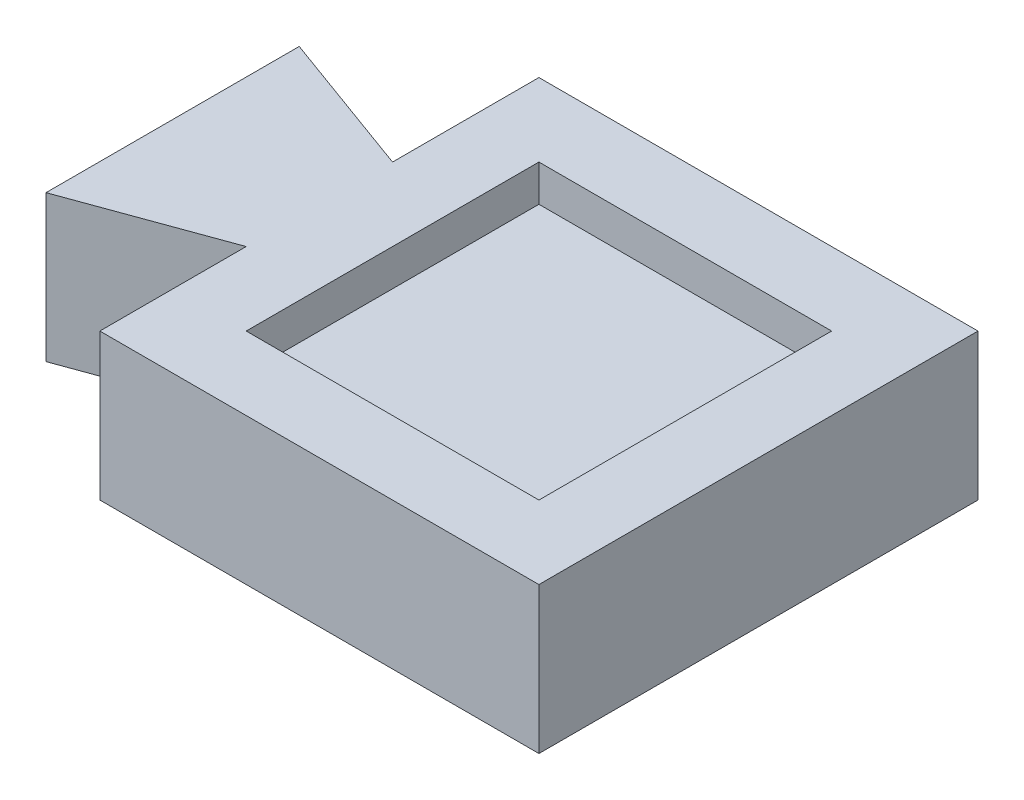
ISO-10303-21;
HEADER;
FILE_DESCRIPTION(('STEP AP214'),'2;1');
FILE_NAME('part.step','',(''),(''),'','','');
FILE_SCHEMA(('AUTOMOTIVE_DESIGN { 1 0 10303 214 1 1 1 1 }'));
ENDSEC;
DATA;
#1=APPLICATION_CONTEXT('core data for automotive mechanical design processes');
#2=APPLICATION_PROTOCOL_DEFINITION('international standard','automotive_design',2000,#1);
#3=PRODUCT_CONTEXT('',#1,'mechanical');
#4=PRODUCT('Part','Part','',(#3));
#5=PRODUCT_RELATED_PRODUCT_CATEGORY('part','',(#4));
#6=PRODUCT_DEFINITION_FORMATION('','',#4);
#7=PRODUCT_DEFINITION_CONTEXT('part definition',#1,'design');
#8=PRODUCT_DEFINITION('design','',#6,#7);
#9=PRODUCT_DEFINITION_SHAPE('','',#8);
#10=(LENGTH_UNIT() NAMED_UNIT(*) SI_UNIT(.MILLI.,.METRE.));
#11=(NAMED_UNIT(*) PLANE_ANGLE_UNIT() SI_UNIT($,.RADIAN.));
#12=(NAMED_UNIT(*) SI_UNIT($,.STERADIAN.) SOLID_ANGLE_UNIT());
#13=UNCERTAINTY_MEASURE_WITH_UNIT(LENGTH_MEASURE(1.E-05),#10,'distance_accuracy_value','');
#14=(GEOMETRIC_REPRESENTATION_CONTEXT(3) GLOBAL_UNCERTAINTY_ASSIGNED_CONTEXT((#13)) GLOBAL_UNIT_ASSIGNED_CONTEXT((#10,
#11,#12)) REPRESENTATION_CONTEXT('',''));
#15=CARTESIAN_POINT('',(0.,0.,0.));
#16=DIRECTION('',(0.,0.,1.));
#17=DIRECTION('',(1.,0.,0.));
#18=AXIS2_PLACEMENT_3D('',#15,#16,#17);
#19=CARTESIAN_POINT('',(0.,25.4,0.));
#20=DIRECTION('',(1.,0.,0.));
#21=DIRECTION('',(0.,0.,-1.));
#22=AXIS2_PLACEMENT_3D('',#19,#20,#21);
#23=PLANE('',#22);
#24=DIRECTION('',(0.,0.,1.));
#25=VECTOR('',#24,1.);
#26=CARTESIAN_POINT('',(0.,0.,0.));
#27=LINE('',#26,#25);
#28=CARTESIAN_POINT('',(0.,0.,0.));
#29=VERTEX_POINT('',#28);
#30=CARTESIAN_POINT('',(0.,0.,25.4));
#31=VERTEX_POINT('',#30);
#32=EDGE_CURVE('E140',#29,#31,#27,.T.);
#33=ORIENTED_EDGE('',*,*,#32,.T.);
#34=DIRECTION('',(0.,-1.,0.));
#35=VECTOR('',#34,1.);
#36=CARTESIAN_POINT('',(0.,25.4,25.4));
#37=LINE('',#36,#35);
#38=CARTESIAN_POINT('',(0.,25.4,25.4));
#39=VERTEX_POINT('',#38);
#40=EDGE_CURVE('E11',#39,#31,#37,.T.);
#41=ORIENTED_EDGE('',*,*,#40,.F.);
#42=DIRECTION('',(0.,0.,1.));
#43=VECTOR('',#42,1.);
#44=CARTESIAN_POINT('',(0.,25.4,0.));
#45=LINE('',#44,#43);
#46=CARTESIAN_POINT('',(0.,25.4,0.));
#47=VERTEX_POINT('',#46);
#48=EDGE_CURVE('E156',#47,#39,#45,.T.);
#49=ORIENTED_EDGE('',*,*,#48,.F.);
#50=DIRECTION('',(0.,-1.,0.));
#51=VECTOR('',#50,1.);
#52=CARTESIAN_POINT('',(0.,25.4,0.));
#53=LINE('',#52,#51);
#54=EDGE_CURVE('E136',#47,#29,#53,.T.);
#55=ORIENTED_EDGE('',*,*,#54,.T.);
#56=EDGE_LOOP('',(#33,#41,#49,#55));
#57=FACE_BOUND('',#56,.T.);
#58=ADVANCED_FACE('F32',(#57),#23,.F.);
#59=CARTESIAN_POINT('',(0.,25.4,25.4));
#60=DIRECTION('',(-0.342020143325673,0.,0.939692620785907));
#61=DIRECTION('',(0.939692620785907,0.,0.342020143325673));
#62=AXIS2_PLACEMENT_3D('',#59,#60,#61);
#63=PLANE('',#62);
#64=DIRECTION('',(-0.939692620785907,0.,-0.342020143325673));
#65=VECTOR('',#64,1.);
#66=CARTESIAN_POINT('',(0.,0.,25.4));
#67=LINE('',#66,#65);
#68=CARTESIAN_POINT('',(-25.4718631557635,0.,16.129));
#69=VERTEX_POINT('',#68);
#70=EDGE_CURVE('E143',#31,#69,#67,.T.);
#71=ORIENTED_EDGE('',*,*,#70,.T.);
#72=DIRECTION('',(0.,-1.,0.));
#73=VECTOR('',#72,1.);
#74=CARTESIAN_POINT('',(-25.4718631557635,25.4,16.129));
#75=LINE('',#74,#73);
#76=CARTESIAN_POINT('',(-25.4718631557635,25.4,16.129));
#77=VERTEX_POINT('',#76);
#78=EDGE_CURVE('E39',#77,#69,#75,.T.);
#79=ORIENTED_EDGE('',*,*,#78,.F.);
#80=DIRECTION('',(-0.939692620785907,0.,-0.342020143325673));
#81=VECTOR('',#80,1.);
#82=CARTESIAN_POINT('',(0.,25.4,25.4));
#83=LINE('',#82,#81);
#84=EDGE_CURVE('E96',#39,#77,#83,.T.);
#85=ORIENTED_EDGE('',*,*,#84,.F.);
#86=ORIENTED_EDGE('',*,*,#40,.T.);
#87=EDGE_LOOP('',(#71,#79,#85,#86));
#88=FACE_BOUND('',#87,.T.);
#89=ADVANCED_FACE('F259',(#88),#63,.F.);
#90=CARTESIAN_POINT('',(-25.4718631557635,25.4,16.129));
#91=DIRECTION('',(1.,0.,0.));
#92=DIRECTION('',(0.,0.,-1.));
#93=AXIS2_PLACEMENT_3D('',#90,#91,#92);
#94=PLANE('',#93);
#95=DIRECTION('',(0.,0.,1.));
#96=VECTOR('',#95,1.);
#97=CARTESIAN_POINT('',(-25.4718631557635,0.,16.129));
#98=LINE('',#97,#96);
#99=CARTESIAN_POINT('',(-25.4718631557635,0.,60.071));
#100=VERTEX_POINT('',#99);
#101=EDGE_CURVE('E146',#69,#100,#98,.T.);
#102=ORIENTED_EDGE('',*,*,#101,.T.);
#103=DIRECTION('',(0.,-1.,0.));
#104=VECTOR('',#103,1.);
#105=CARTESIAN_POINT('',(-25.4718631557635,25.4,60.071));
#106=LINE('',#105,#104);
#107=CARTESIAN_POINT('',(-25.4718631557635,25.4,60.071));
#108=VERTEX_POINT('',#107);
#109=EDGE_CURVE('E163',#108,#100,#106,.T.);
#110=ORIENTED_EDGE('',*,*,#109,.F.);
#111=DIRECTION('',(0.,0.,1.));
#112=VECTOR('',#111,1.);
#113=CARTESIAN_POINT('',(-25.4718631557635,25.4,16.129));
#114=LINE('',#113,#112);
#115=EDGE_CURVE('E171',#77,#108,#114,.T.);
#116=ORIENTED_EDGE('',*,*,#115,.F.);
#117=ORIENTED_EDGE('',*,*,#78,.T.);
#118=EDGE_LOOP('',(#102,#110,#116,#117));
#119=FACE_BOUND('',#118,.T.);
#120=ADVANCED_FACE('F169',(#119),#94,.F.);
#121=CARTESIAN_POINT('',(-25.4718631557635,25.4,60.071));
#122=DIRECTION('',(-0.342020143325673,0.,-0.939692620785907));
#123=DIRECTION('',(-0.939692620785907,0.,0.342020143325673));
#124=AXIS2_PLACEMENT_3D('',#121,#122,#123);
#125=PLANE('',#124);
#126=DIRECTION('',(0.939692620785907,0.,-0.342020143325673));
#127=VECTOR('',#126,1.);
#128=CARTESIAN_POINT('',(-25.4718631557635,0.,60.071));
#129=LINE('',#128,#127);
#130=CARTESIAN_POINT('',(0.,0.,50.8));
#131=VERTEX_POINT('',#130);
#132=EDGE_CURVE('E148',#100,#131,#129,.T.);
#133=ORIENTED_EDGE('',*,*,#132,.T.);
#134=DIRECTION('',(0.,-1.,0.));
#135=VECTOR('',#134,1.);
#136=CARTESIAN_POINT('',(0.,25.4,50.8));
#137=LINE('',#136,#135);
#138=CARTESIAN_POINT('',(0.,25.4,50.8));
#139=VERTEX_POINT('',#138);
#140=EDGE_CURVE('E160',#139,#131,#137,.T.);
#141=ORIENTED_EDGE('',*,*,#140,.F.);
#142=DIRECTION('',(0.939692620785907,0.,-0.342020143325673));
#143=VECTOR('',#142,1.);
#144=CARTESIAN_POINT('',(-25.4718631557635,25.4,60.071));
#145=LINE('',#144,#143);
#146=EDGE_CURVE('E183',#108,#139,#145,.T.);
#147=ORIENTED_EDGE('',*,*,#146,.F.);
#148=ORIENTED_EDGE('',*,*,#109,.T.);
#149=EDGE_LOOP('',(#133,#141,#147,#148));
#150=FACE_BOUND('',#149,.T.);
#151=ADVANCED_FACE('F179',(#150),#125,.F.);
#152=CARTESIAN_POINT('',(0.,25.4,50.8));
#153=DIRECTION('',(1.,0.,0.));
#154=DIRECTION('',(0.,0.,-1.));
#155=AXIS2_PLACEMENT_3D('',#152,#153,#154);
#156=PLANE('',#155);
#157=DIRECTION('',(0.,0.,1.));
#158=VECTOR('',#157,1.);
#159=CARTESIAN_POINT('',(0.,0.,50.8));
#160=LINE('',#159,#158);
#161=CARTESIAN_POINT('',(0.,0.,76.2));
#162=VERTEX_POINT('',#161);
#163=EDGE_CURVE('E150',#131,#162,#160,.T.);
#164=ORIENTED_EDGE('',*,*,#163,.T.);
#165=DIRECTION('',(0.,-1.,0.));
#166=VECTOR('',#165,1.);
#167=CARTESIAN_POINT('',(0.,25.4,76.2));
#168=LINE('',#167,#166);
#169=CARTESIAN_POINT('',(0.,25.4,76.2));
#170=VERTEX_POINT('',#169);
#171=EDGE_CURVE('E131',#170,#162,#168,.T.);
#172=ORIENTED_EDGE('',*,*,#171,.F.);
#173=DIRECTION('',(0.,0.,1.));
#174=VECTOR('',#173,1.);
#175=CARTESIAN_POINT('',(0.,25.4,50.8));
#176=LINE('',#175,#174);
#177=EDGE_CURVE('E119',#139,#170,#176,.T.);
#178=ORIENTED_EDGE('',*,*,#177,.F.);
#179=ORIENTED_EDGE('',*,*,#140,.T.);
#180=EDGE_LOOP('',(#164,#172,#178,#179));
#181=FACE_BOUND('',#180,.T.);
#182=ADVANCED_FACE('F182',(#181),#156,.F.);
#183=CARTESIAN_POINT('',(0.,25.4,76.2));
#184=DIRECTION('',(0.,0.,-1.));
#185=DIRECTION('',(-1.,0.,0.));
#186=AXIS2_PLACEMENT_3D('',#183,#184,#185);
#187=PLANE('',#186);
#188=DIRECTION('',(1.,0.,0.));
#189=VECTOR('',#188,1.);
#190=CARTESIAN_POINT('',(0.,0.,76.2));
#191=LINE('',#190,#189);
#192=CARTESIAN_POINT('',(76.2,0.,76.2));
#193=VERTEX_POINT('',#192);
#194=EDGE_CURVE('E128',#162,#193,#191,.T.);
#195=ORIENTED_EDGE('',*,*,#194,.T.);
#196=DIRECTION('',(0.,-1.,0.));
#197=VECTOR('',#196,1.);
#198=CARTESIAN_POINT('',(76.2,25.4,76.2));
#199=LINE('',#198,#197);
#200=CARTESIAN_POINT('',(76.2,25.4,76.2));
#201=VERTEX_POINT('',#200);
#202=EDGE_CURVE('E125',#201,#193,#199,.T.);
#203=ORIENTED_EDGE('',*,*,#202,.F.);
#204=DIRECTION('',(1.,0.,0.));
#205=VECTOR('',#204,1.);
#206=CARTESIAN_POINT('',(0.,25.4,76.2));
#207=LINE('',#206,#205);
#208=EDGE_CURVE('E112',#170,#201,#207,.T.);
#209=ORIENTED_EDGE('',*,*,#208,.F.);
#210=ORIENTED_EDGE('',*,*,#171,.T.);
#211=EDGE_LOOP('',(#195,#203,#209,#210));
#212=FACE_BOUND('',#211,.T.);
#213=ADVANCED_FACE('F126',(#212),#187,.F.);
#214=CARTESIAN_POINT('',(76.2,25.4,76.2));
#215=DIRECTION('',(-1.,0.,0.));
#216=DIRECTION('',(0.,0.,1.));
#217=AXIS2_PLACEMENT_3D('',#214,#215,#216);
#218=PLANE('',#217);
#219=DIRECTION('',(0.,0.,-1.));
#220=VECTOR('',#219,1.);
#221=CARTESIAN_POINT('',(76.2,0.,76.2));
#222=LINE('',#221,#220);
#223=CARTESIAN_POINT('',(76.2,0.,0.));
#224=VERTEX_POINT('',#223);
#225=EDGE_CURVE('E153',#193,#224,#222,.T.);
#226=ORIENTED_EDGE('',*,*,#225,.T.);
#227=DIRECTION('',(0.,-1.,0.));
#228=VECTOR('',#227,1.);
#229=CARTESIAN_POINT('',(76.2,25.4,0.));
#230=LINE('',#229,#228);
#231=CARTESIAN_POINT('',(76.2,25.4,0.));
#232=VERTEX_POINT('',#231);
#233=EDGE_CURVE('E132',#232,#224,#230,.T.);
#234=ORIENTED_EDGE('',*,*,#233,.F.);
#235=DIRECTION('',(0.,0.,-1.));
#236=VECTOR('',#235,1.);
#237=CARTESIAN_POINT('',(76.2,25.4,76.2));
#238=LINE('',#237,#236);
#239=EDGE_CURVE('E116',#201,#232,#238,.T.);
#240=ORIENTED_EDGE('',*,*,#239,.F.);
#241=ORIENTED_EDGE('',*,*,#202,.T.);
#242=EDGE_LOOP('',(#226,#234,#240,#241));
#243=FACE_BOUND('',#242,.T.);
#244=ADVANCED_FACE('F134',(#243),#218,.F.);
#245=CARTESIAN_POINT('',(76.2,25.4,0.));
#246=DIRECTION('',(0.,0.,1.));
#247=DIRECTION('',(1.,0.,0.));
#248=AXIS2_PLACEMENT_3D('',#245,#246,#247);
#249=PLANE('',#248);
#250=DIRECTION('',(-1.,0.,0.));
#251=VECTOR('',#250,1.);
#252=CARTESIAN_POINT('',(76.2,0.,0.));
#253=LINE('',#252,#251);
#254=EDGE_CURVE('E88',#224,#29,#253,.T.);
#255=ORIENTED_EDGE('',*,*,#254,.T.);
#256=ORIENTED_EDGE('',*,*,#54,.F.);
#257=DIRECTION('',(-1.,0.,0.));
#258=VECTOR('',#257,1.);
#259=CARTESIAN_POINT('',(76.2,25.4,0.));
#260=LINE('',#259,#258);
#261=EDGE_CURVE('E55',#232,#47,#260,.T.);
#262=ORIENTED_EDGE('',*,*,#261,.F.);
#263=ORIENTED_EDGE('',*,*,#233,.T.);
#264=EDGE_LOOP('',(#255,#256,#262,#263));
#265=FACE_BOUND('',#264,.T.);
#266=ADVANCED_FACE('F266',(#265),#249,.F.);
#267=CARTESIAN_POINT('',(0.,25.4,0.));
#268=DIRECTION('',(0.,1.,0.));
#269=DIRECTION('',(0.,0.,1.));
#270=AXIS2_PLACEMENT_3D('',#267,#268,#269);
#271=PLANE('',#270);
#272=DIRECTION('',(0.,0.,-1.));
#273=VECTOR('',#272,1.);
#274=CARTESIAN_POINT('',(63.5,25.4,12.7));
#275=LINE('',#274,#273);
#276=CARTESIAN_POINT('',(63.5,25.4,63.5));
#277=VERTEX_POINT('',#276);
#278=CARTESIAN_POINT('',(63.5,25.4,12.7));
#279=VERTEX_POINT('',#278);
#280=EDGE_CURVE('E46',#277,#279,#275,.T.);
#281=ORIENTED_EDGE('',*,*,#280,.F.);
#282=DIRECTION('',(1.,0.,0.));
#283=VECTOR('',#282,1.);
#284=CARTESIAN_POINT('',(12.7,25.4,63.5));
#285=LINE('',#284,#283);
#286=CARTESIAN_POINT('',(12.7,25.4,63.5));
#287=VERTEX_POINT('',#286);
#288=EDGE_CURVE('E199',#287,#277,#285,.T.);
#289=ORIENTED_EDGE('',*,*,#288,.F.);
#290=DIRECTION('',(0.,0.,1.));
#291=VECTOR('',#290,1.);
#292=CARTESIAN_POINT('',(12.7,25.4,12.7));
#293=LINE('',#292,#291);
#294=CARTESIAN_POINT('',(12.7,25.4,12.7));
#295=VERTEX_POINT('',#294);
#296=EDGE_CURVE('E203',#295,#287,#293,.T.);
#297=ORIENTED_EDGE('',*,*,#296,.F.);
#298=DIRECTION('',(-1.,0.,0.));
#299=VECTOR('',#298,1.);
#300=CARTESIAN_POINT('',(12.7,25.4,12.7));
#301=LINE('',#300,#299);
#302=EDGE_CURVE('E206',#279,#295,#301,.T.);
#303=ORIENTED_EDGE('',*,*,#302,.F.);
#304=EDGE_LOOP('',(#281,#289,#297,#303));
#305=FACE_BOUND('',#304,.T.);
#306=ORIENTED_EDGE('',*,*,#48,.T.);
#307=ORIENTED_EDGE('',*,*,#84,.T.);
#308=ORIENTED_EDGE('',*,*,#115,.T.);
#309=ORIENTED_EDGE('',*,*,#146,.T.);
#310=ORIENTED_EDGE('',*,*,#177,.T.);
#311=ORIENTED_EDGE('',*,*,#208,.T.);
#312=ORIENTED_EDGE('',*,*,#239,.T.);
#313=ORIENTED_EDGE('',*,*,#261,.T.);
#314=EDGE_LOOP('',(#306,#307,#308,#309,#310,#311,#312,#313));
#315=FACE_BOUND('',#314,.T.);
#316=ADVANCED_FACE('F114',(#305,#315),#271,.T.);
#317=CARTESIAN_POINT('',(0.,0.,0.));
#318=DIRECTION('',(0.,1.,0.));
#319=DIRECTION('',(0.,0.,1.));
#320=AXIS2_PLACEMENT_3D('',#317,#318,#319);
#321=PLANE('',#320);
#322=ORIENTED_EDGE('',*,*,#32,.F.);
#323=ORIENTED_EDGE('',*,*,#254,.F.);
#324=ORIENTED_EDGE('',*,*,#225,.F.);
#325=ORIENTED_EDGE('',*,*,#194,.F.);
#326=ORIENTED_EDGE('',*,*,#163,.F.);
#327=ORIENTED_EDGE('',*,*,#132,.F.);
#328=ORIENTED_EDGE('',*,*,#101,.F.);
#329=ORIENTED_EDGE('',*,*,#70,.F.);
#330=EDGE_LOOP('',(#322,#323,#324,#325,#326,#327,#328,#329));
#331=FACE_BOUND('',#330,.T.);
#332=ADVANCED_FACE('F175',(#331),#321,.F.);
#333=CARTESIAN_POINT('',(63.5,19.05,12.7));
#334=DIRECTION('',(1.,0.,0.));
#335=DIRECTION('',(0.,0.,-1.));
#336=AXIS2_PLACEMENT_3D('',#333,#334,#335);
#337=PLANE('',#336);
#338=ORIENTED_EDGE('',*,*,#280,.T.);
#339=DIRECTION('',(0.,1.,0.));
#340=VECTOR('',#339,1.);
#341=CARTESIAN_POINT('',(63.5,19.05,12.7));
#342=LINE('',#341,#340);
#343=CARTESIAN_POINT('',(63.5,19.05,12.7));
#344=VERTEX_POINT('',#343);
#345=EDGE_CURVE('E189',#344,#279,#342,.T.);
#346=ORIENTED_EDGE('',*,*,#345,.F.);
#347=DIRECTION('',(0.,0.,-1.));
#348=VECTOR('',#347,1.);
#349=CARTESIAN_POINT('',(63.5,19.05,12.7));
#350=LINE('',#349,#348);
#351=CARTESIAN_POINT('',(63.5,19.05,63.5));
#352=VERTEX_POINT('',#351);
#353=EDGE_CURVE('E202',#352,#344,#350,.T.);
#354=ORIENTED_EDGE('',*,*,#353,.F.);
#355=DIRECTION('',(0.,1.,0.));
#356=VECTOR('',#355,1.);
#357=CARTESIAN_POINT('',(63.5,19.05,63.5));
#358=LINE('',#357,#356);
#359=EDGE_CURVE('E144',#352,#277,#358,.T.);
#360=ORIENTED_EDGE('',*,*,#359,.T.);
#361=EDGE_LOOP('',(#338,#346,#354,#360));
#362=FACE_BOUND('',#361,.T.);
#363=ADVANCED_FACE('F227',(#362),#337,.F.);
#364=CARTESIAN_POINT('',(12.7,19.05,63.5));
#365=DIRECTION('',(0.,0.,1.));
#366=DIRECTION('',(1.,0.,0.));
#367=AXIS2_PLACEMENT_3D('',#364,#365,#366);
#368=PLANE('',#367);
#369=ORIENTED_EDGE('',*,*,#288,.T.);
#370=ORIENTED_EDGE('',*,*,#359,.F.);
#371=DIRECTION('',(1.,0.,0.));
#372=VECTOR('',#371,1.);
#373=CARTESIAN_POINT('',(12.7,19.05,63.5));
#374=LINE('',#373,#372);
#375=CARTESIAN_POINT('',(12.7,19.05,63.5));
#376=VERTEX_POINT('',#375);
#377=EDGE_CURVE('E192',#376,#352,#374,.T.);
#378=ORIENTED_EDGE('',*,*,#377,.F.);
#379=DIRECTION('',(0.,1.,0.));
#380=VECTOR('',#379,1.);
#381=CARTESIAN_POINT('',(12.7,19.05,63.5));
#382=LINE('',#381,#380);
#383=EDGE_CURVE('E195',#376,#287,#382,.T.);
#384=ORIENTED_EDGE('',*,*,#383,.T.);
#385=EDGE_LOOP('',(#369,#370,#378,#384));
#386=FACE_BOUND('',#385,.T.);
#387=ADVANCED_FACE('F238',(#386),#368,.F.);
#388=CARTESIAN_POINT('',(12.7,19.05,12.7));
#389=DIRECTION('',(-1.,0.,0.));
#390=DIRECTION('',(0.,0.,1.));
#391=AXIS2_PLACEMENT_3D('',#388,#389,#390);
#392=PLANE('',#391);
#393=ORIENTED_EDGE('',*,*,#296,.T.);
#394=ORIENTED_EDGE('',*,*,#383,.F.);
#395=DIRECTION('',(0.,0.,1.));
#396=VECTOR('',#395,1.);
#397=CARTESIAN_POINT('',(12.7,19.05,12.7));
#398=LINE('',#397,#396);
#399=CARTESIAN_POINT('',(12.7,19.05,12.7));
#400=VERTEX_POINT('',#399);
#401=EDGE_CURVE('E212',#400,#376,#398,.T.);
#402=ORIENTED_EDGE('',*,*,#401,.F.);
#403=DIRECTION('',(0.,1.,0.));
#404=VECTOR('',#403,1.);
#405=CARTESIAN_POINT('',(12.7,19.05,12.7));
#406=LINE('',#405,#404);
#407=EDGE_CURVE('E191',#400,#295,#406,.T.);
#408=ORIENTED_EDGE('',*,*,#407,.T.);
#409=EDGE_LOOP('',(#393,#394,#402,#408));
#410=FACE_BOUND('',#409,.T.);
#411=ADVANCED_FACE('F243',(#410),#392,.F.);
#412=CARTESIAN_POINT('',(12.7,19.05,12.7));
#413=DIRECTION('',(0.,0.,-1.));
#414=DIRECTION('',(-1.,0.,0.));
#415=AXIS2_PLACEMENT_3D('',#412,#413,#414);
#416=PLANE('',#415);
#417=ORIENTED_EDGE('',*,*,#302,.T.);
#418=ORIENTED_EDGE('',*,*,#407,.F.);
#419=DIRECTION('',(-1.,0.,0.));
#420=VECTOR('',#419,1.);
#421=CARTESIAN_POINT('',(12.7,19.05,12.7));
#422=LINE('',#421,#420);
#423=EDGE_CURVE('E215',#344,#400,#422,.T.);
#424=ORIENTED_EDGE('',*,*,#423,.F.);
#425=ORIENTED_EDGE('',*,*,#345,.T.);
#426=EDGE_LOOP('',(#417,#418,#424,#425));
#427=FACE_BOUND('',#426,.T.);
#428=ADVANCED_FACE('F248',(#427),#416,.F.);
#429=CARTESIAN_POINT('',(0.,19.05,0.));
#430=DIRECTION('',(0.,1.,0.));
#431=DIRECTION('',(0.,0.,1.));
#432=AXIS2_PLACEMENT_3D('',#429,#430,#431);
#433=PLANE('',#432);
#434=ORIENTED_EDGE('',*,*,#353,.T.);
#435=ORIENTED_EDGE('',*,*,#423,.T.);
#436=ORIENTED_EDGE('',*,*,#401,.T.);
#437=ORIENTED_EDGE('',*,*,#377,.T.);
#438=EDGE_LOOP('',(#434,#435,#436,#437));
#439=FACE_BOUND('',#438,.T.);
#440=ADVANCED_FACE('F222',(#439),#433,.T.);
#441=CLOSED_SHELL('',(#58,#89,#120,#151,#182,#213,#244,#266,#316,#332,#363,#387,#411,#428,#440));
#442=MANIFOLD_SOLID_BREP('B2',#441);
#443=ADVANCED_BREP_SHAPE_REPRESENTATION('',(#18,#442),#14);
#444=SHAPE_DEFINITION_REPRESENTATION(#9,#443);
ENDSEC;
END-ISO-10303-21;
